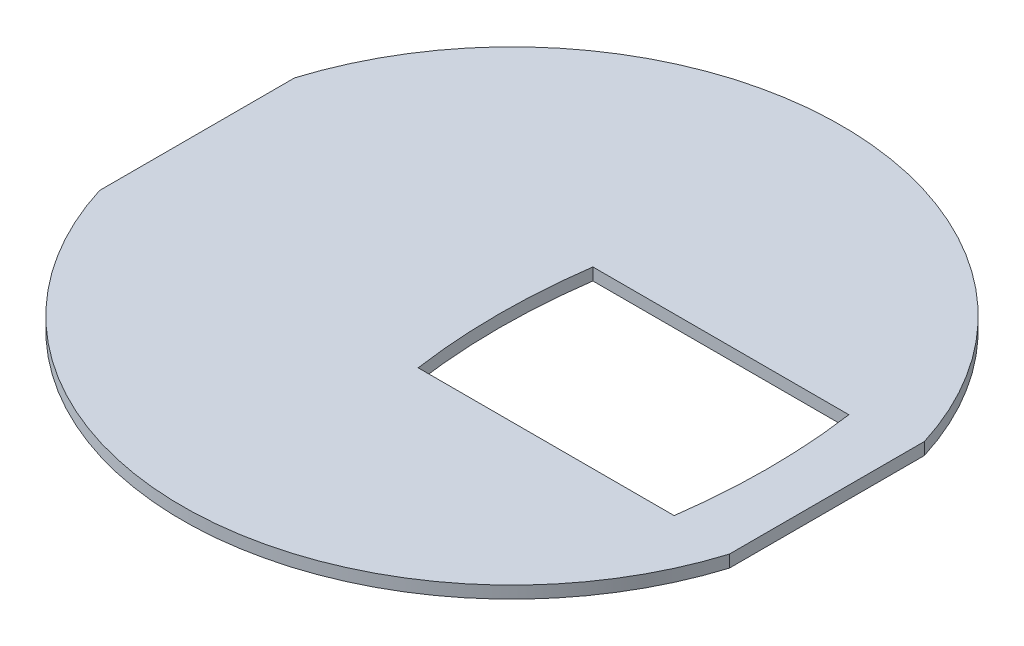
ISO-10303-21;
HEADER;
FILE_DESCRIPTION(('STEP AP214'),'2;1');
FILE_NAME('part.step','',(''),(''),'','','');
FILE_SCHEMA(('AUTOMOTIVE_DESIGN { 1 0 10303 214 1 1 1 1 }'));
ENDSEC;
DATA;
#1=APPLICATION_CONTEXT('core data for automotive mechanical design processes');
#2=APPLICATION_PROTOCOL_DEFINITION('international standard','automotive_design',2000,#1);
#3=PRODUCT_CONTEXT('',#1,'mechanical');
#4=PRODUCT('Part','Part','',(#3));
#5=PRODUCT_RELATED_PRODUCT_CATEGORY('part','',(#4));
#6=PRODUCT_DEFINITION_FORMATION('','',#4);
#7=PRODUCT_DEFINITION_CONTEXT('part definition',#1,'design');
#8=PRODUCT_DEFINITION('design','',#6,#7);
#9=PRODUCT_DEFINITION_SHAPE('','',#8);
#10=(LENGTH_UNIT() NAMED_UNIT(*) SI_UNIT(.MILLI.,.METRE.));
#11=(NAMED_UNIT(*) PLANE_ANGLE_UNIT() SI_UNIT($,.RADIAN.));
#12=(NAMED_UNIT(*) SI_UNIT($,.STERADIAN.) SOLID_ANGLE_UNIT());
#13=UNCERTAINTY_MEASURE_WITH_UNIT(LENGTH_MEASURE(1.E-05),#10,'distance_accuracy_value','');
#14=(GEOMETRIC_REPRESENTATION_CONTEXT(3) GLOBAL_UNCERTAINTY_ASSIGNED_CONTEXT((#13)) GLOBAL_UNIT_ASSIGNED_CONTEXT((#10,
#11,#12)) REPRESENTATION_CONTEXT('',''));
#15=CARTESIAN_POINT('',(0.,0.,0.));
#16=DIRECTION('',(0.,0.,1.));
#17=DIRECTION('',(1.,0.,0.));
#18=AXIS2_PLACEMENT_3D('',#15,#16,#17);
#19=CARTESIAN_POINT('',(0.,3.,0.));
#20=DIRECTION('',(0.,-1.,0.));
#21=DIRECTION('',(0.,0.,-1.));
#22=AXIS2_PLACEMENT_3D('',#19,#20,#21);
#23=CYLINDRICAL_SURFACE('',#22,81.1310667993464);
#24=CARTESIAN_POINT('',(0.,0.,0.));
#25=DIRECTION('',(0.,1.,0.));
#26=DIRECTION('',(0.,0.,1.));
#27=AXIS2_PLACEMENT_3D('',#24,#25,#26);
#28=CIRCLE('',#27,81.1310667993464);
#29=CARTESIAN_POINT('',(77.5,0.,-24.));
#30=VERTEX_POINT('',#29);
#31=CARTESIAN_POINT('',(-77.5,0.,-24.));
#32=VERTEX_POINT('',#31);
#33=EDGE_CURVE('E123',#30,#32,#28,.T.);
#34=ORIENTED_EDGE('',*,*,#33,.T.);
#35=DIRECTION('',(0.,-1.,0.));
#36=VECTOR('',#35,1.);
#37=CARTESIAN_POINT('',(-77.5,3.,-24.));
#38=LINE('',#37,#36);
#39=CARTESIAN_POINT('',(-77.5,3.,-24.));
#40=VERTEX_POINT('',#39);
#41=EDGE_CURVE('E152',#40,#32,#38,.T.);
#42=ORIENTED_EDGE('',*,*,#41,.F.);
#43=CARTESIAN_POINT('',(0.,3.,0.));
#44=DIRECTION('',(0.,1.,0.));
#45=DIRECTION('',(0.,0.,1.));
#46=AXIS2_PLACEMENT_3D('',#43,#44,#45);
#47=CIRCLE('',#46,81.1310667993464);
#48=CARTESIAN_POINT('',(77.5,3.,-24.));
#49=VERTEX_POINT('',#48);
#50=EDGE_CURVE('E126',#49,#40,#47,.T.);
#51=ORIENTED_EDGE('',*,*,#50,.F.);
#52=DIRECTION('',(0.,-1.,0.));
#53=VECTOR('',#52,1.);
#54=CARTESIAN_POINT('',(77.5,3.,-24.));
#55=LINE('',#54,#53);
#56=EDGE_CURVE('E136',#49,#30,#55,.T.);
#57=ORIENTED_EDGE('',*,*,#56,.T.);
#58=EDGE_LOOP('',(#34,#42,#51,#57));
#59=FACE_BOUND('',#58,.T.);
#60=ADVANCED_FACE('F33',(#59),#23,.T.);
#61=CARTESIAN_POINT('',(-77.5,3.,-24.));
#62=DIRECTION('',(1.,0.,0.));
#63=DIRECTION('',(0.,0.,-1.));
#64=AXIS2_PLACEMENT_3D('',#61,#62,#63);
#65=PLANE('',#64);
#66=DIRECTION('',(0.,0.,1.));
#67=VECTOR('',#66,1.);
#68=CARTESIAN_POINT('',(-77.5,0.,-24.));
#69=LINE('',#68,#67);
#70=CARTESIAN_POINT('',(-77.5,0.,24.));
#71=VERTEX_POINT('',#70);
#72=EDGE_CURVE('E139',#32,#71,#69,.T.);
#73=ORIENTED_EDGE('',*,*,#72,.T.);
#74=DIRECTION('',(0.,-1.,0.));
#75=VECTOR('',#74,1.);
#76=CARTESIAN_POINT('',(-77.5,3.,24.));
#77=LINE('',#76,#75);
#78=CARTESIAN_POINT('',(-77.5,3.,24.));
#79=VERTEX_POINT('',#78);
#80=EDGE_CURVE('E149',#79,#71,#77,.T.);
#81=ORIENTED_EDGE('',*,*,#80,.F.);
#82=DIRECTION('',(0.,0.,1.));
#83=VECTOR('',#82,1.);
#84=CARTESIAN_POINT('',(-77.5,3.,-24.));
#85=LINE('',#84,#83);
#86=EDGE_CURVE('E129',#40,#79,#85,.T.);
#87=ORIENTED_EDGE('',*,*,#86,.F.);
#88=ORIENTED_EDGE('',*,*,#41,.T.);
#89=EDGE_LOOP('',(#73,#81,#87,#88));
#90=FACE_BOUND('',#89,.T.);
#91=ADVANCED_FACE('F176',(#90),#65,.F.);
#92=CARTESIAN_POINT('',(0.,3.,0.));
#93=DIRECTION('',(0.,-1.,0.));
#94=DIRECTION('',(0.,0.,-1.));
#95=AXIS2_PLACEMENT_3D('',#92,#93,#94);
#96=CYLINDRICAL_SURFACE('',#95,81.1310667993464);
#97=CARTESIAN_POINT('',(0.,0.,0.));
#98=DIRECTION('',(0.,1.,0.));
#99=DIRECTION('',(0.,0.,1.));
#100=AXIS2_PLACEMENT_3D('',#97,#98,#99);
#101=CIRCLE('',#100,81.1310667993464);
#102=CARTESIAN_POINT('',(77.5,0.,24.));
#103=VERTEX_POINT('',#102);
#104=EDGE_CURVE('E141',#71,#103,#101,.T.);
#105=ORIENTED_EDGE('',*,*,#104,.T.);
#106=DIRECTION('',(0.,-1.,0.));
#107=VECTOR('',#106,1.);
#108=CARTESIAN_POINT('',(77.5,3.,24.));
#109=LINE('',#108,#107);
#110=CARTESIAN_POINT('',(77.5,3.,24.));
#111=VERTEX_POINT('',#110);
#112=EDGE_CURVE('E146',#111,#103,#109,.T.);
#113=ORIENTED_EDGE('',*,*,#112,.F.);
#114=CARTESIAN_POINT('',(0.,3.,0.));
#115=DIRECTION('',(0.,1.,0.));
#116=DIRECTION('',(0.,0.,1.));
#117=AXIS2_PLACEMENT_3D('',#114,#115,#116);
#118=CIRCLE('',#117,81.1310667993464);
#119=EDGE_CURVE('E132',#79,#111,#118,.T.);
#120=ORIENTED_EDGE('',*,*,#119,.F.);
#121=ORIENTED_EDGE('',*,*,#80,.T.);
#122=EDGE_LOOP('',(#105,#113,#120,#121));
#123=FACE_BOUND('',#122,.T.);
#124=ADVANCED_FACE('F181',(#123),#96,.T.);
#125=CARTESIAN_POINT('',(77.5,3.,-24.));
#126=DIRECTION('',(-1.,0.,0.));
#127=DIRECTION('',(0.,0.,1.));
#128=AXIS2_PLACEMENT_3D('',#125,#126,#127);
#129=PLANE('',#128);
#130=DIRECTION('',(0.,0.,-1.));
#131=VECTOR('',#130,1.);
#132=CARTESIAN_POINT('',(77.5,0.,-24.));
#133=LINE('',#132,#131);
#134=EDGE_CURVE('E130',#103,#30,#133,.T.);
#135=ORIENTED_EDGE('',*,*,#134,.T.);
#136=ORIENTED_EDGE('',*,*,#56,.F.);
#137=DIRECTION('',(0.,0.,-1.));
#138=VECTOR('',#137,1.);
#139=CARTESIAN_POINT('',(77.5,3.,-24.));
#140=LINE('',#139,#138);
#141=EDGE_CURVE('E134',#111,#49,#140,.T.);
#142=ORIENTED_EDGE('',*,*,#141,.F.);
#143=ORIENTED_EDGE('',*,*,#112,.T.);
#144=EDGE_LOOP('',(#135,#136,#142,#143));
#145=FACE_BOUND('',#144,.T.);
#146=ADVANCED_FACE('F194',(#145),#129,.F.);
#147=CARTESIAN_POINT('',(0.,3.,0.));
#148=DIRECTION('',(0.,1.,0.));
#149=DIRECTION('',(0.,0.,1.));
#150=AXIS2_PLACEMENT_3D('',#147,#148,#149);
#151=PLANE('',#150);
#152=CARTESIAN_POINT('',(-89.0647362828231,3.,1.0950834408699));
#153=DIRECTION('',(0.,1.,0.));
#154=DIRECTION('',(0.,0.,-1.));
#155=AXIS2_PLACEMENT_3D('',#152,#153,#154);
#156=CIRCLE('',#155,153.08206715511);
#157=CARTESIAN_POINT('',(62.5,3.,22.5950834408699));
#158=VERTEX_POINT('',#157);
#159=CARTESIAN_POINT('',(62.5,3.,-20.4049165591301));
#160=VERTEX_POINT('',#159);
#161=EDGE_CURVE('E47',#158,#160,#156,.T.);
#162=ORIENTED_EDGE('',*,*,#161,.F.);
#163=DIRECTION('',(1.,0.,0.));
#164=VECTOR('',#163,1.);
#165=CARTESIAN_POINT('',(62.5,3.,22.5950834408699));
#166=LINE('',#165,#164);
#167=CARTESIAN_POINT('',(-0.499999999999973,3.,22.5950834408699));
#168=VERTEX_POINT('',#167);
#169=EDGE_CURVE('E116',#168,#158,#166,.T.);
#170=ORIENTED_EDGE('',*,*,#169,.F.);
#171=CARTESIAN_POINT('',(150.371254969287,3.,1.09508344086993));
#172=DIRECTION('',(0.,1.,0.));
#173=DIRECTION('',(0.,0.,1.));
#174=AXIS2_PLACEMENT_3D('',#171,#172,#173);
#175=CIRCLE('',#174,152.39549066822);
#176=CARTESIAN_POINT('',(-0.49999999999998,3.,-20.4049165591301));
#177=VERTEX_POINT('',#176);
#178=EDGE_CURVE('E100',#177,#168,#175,.T.);
#179=ORIENTED_EDGE('',*,*,#178,.F.);
#180=DIRECTION('',(-1.,0.,0.));
#181=VECTOR('',#180,1.);
#182=CARTESIAN_POINT('',(62.5,3.,-20.4049165591301));
#183=LINE('',#182,#181);
#184=EDGE_CURVE('E109',#160,#177,#183,.T.);
#185=ORIENTED_EDGE('',*,*,#184,.F.);
#186=EDGE_LOOP('',(#162,#170,#179,#185));
#187=FACE_BOUND('',#186,.T.);
#188=ORIENTED_EDGE('',*,*,#50,.T.);
#189=ORIENTED_EDGE('',*,*,#86,.T.);
#190=ORIENTED_EDGE('',*,*,#119,.T.);
#191=ORIENTED_EDGE('',*,*,#141,.T.);
#192=EDGE_LOOP('',(#188,#189,#190,#191));
#193=FACE_BOUND('',#192,.T.);
#194=ADVANCED_FACE('F113',(#187,#193),#151,.T.);
#195=CARTESIAN_POINT('',(0.,0.,0.));
#196=DIRECTION('',(0.,1.,0.));
#197=DIRECTION('',(0.,0.,1.));
#198=AXIS2_PLACEMENT_3D('',#195,#196,#197);
#199=PLANE('',#198);
#200=DIRECTION('',(1.,0.,0.));
#201=VECTOR('',#200,1.);
#202=CARTESIAN_POINT('',(0.,0.,22.5950834408699));
#203=LINE('',#202,#201);
#204=CARTESIAN_POINT('',(-0.499999999999973,0.,22.5950834408699));
#205=VERTEX_POINT('',#204);
#206=CARTESIAN_POINT('',(62.5,0.,22.5950834408699));
#207=VERTEX_POINT('',#206);
#208=EDGE_CURVE('E40',#205,#207,#203,.T.);
#209=ORIENTED_EDGE('',*,*,#208,.T.);
#210=CARTESIAN_POINT('',(-89.0647362828231,0.,1.0950834408699));
#211=DIRECTION('',(0.,1.,0.));
#212=DIRECTION('',(0.,0.,1.));
#213=AXIS2_PLACEMENT_3D('',#210,#211,#212);
#214=CIRCLE('',#213,153.08206715511);
#215=CARTESIAN_POINT('',(62.5,0.,-20.4049165591301));
#216=VERTEX_POINT('',#215);
#217=EDGE_CURVE('E11',#207,#216,#214,.T.);
#218=ORIENTED_EDGE('',*,*,#217,.T.);
#219=DIRECTION('',(-1.,0.,0.));
#220=VECTOR('',#219,1.);
#221=CARTESIAN_POINT('',(0.,0.,-20.4049165591301));
#222=LINE('',#221,#220);
#223=CARTESIAN_POINT('',(-0.49999999999998,0.,-20.4049165591301));
#224=VERTEX_POINT('',#223);
#225=EDGE_CURVE('E155',#216,#224,#222,.T.);
#226=ORIENTED_EDGE('',*,*,#225,.T.);
#227=CARTESIAN_POINT('',(150.371254969287,0.,1.09508344086993));
#228=DIRECTION('',(0.,1.,0.));
#229=DIRECTION('',(0.,0.,1.));
#230=AXIS2_PLACEMENT_3D('',#227,#228,#229);
#231=CIRCLE('',#230,152.39549066822);
#232=EDGE_CURVE('E103',#224,#205,#231,.T.);
#233=ORIENTED_EDGE('',*,*,#232,.T.);
#234=EDGE_LOOP('',(#209,#218,#226,#233));
#235=FACE_BOUND('',#234,.T.);
#236=ORIENTED_EDGE('',*,*,#33,.F.);
#237=ORIENTED_EDGE('',*,*,#134,.F.);
#238=ORIENTED_EDGE('',*,*,#104,.F.);
#239=ORIENTED_EDGE('',*,*,#72,.F.);
#240=EDGE_LOOP('',(#236,#237,#238,#239));
#241=FACE_BOUND('',#240,.T.);
#242=ADVANCED_FACE('F159',(#235,#241),#199,.F.);
#243=CARTESIAN_POINT('',(-89.0647362828231,-2.5,1.0950834408699));
#244=DIRECTION('',(0.,1.,0.));
#245=DIRECTION('',(0.,0.,1.));
#246=AXIS2_PLACEMENT_3D('',#243,#244,#245);
#247=CYLINDRICAL_SURFACE('',#246,153.08206715511);
#248=DIRECTION('',(0.,1.,0.));
#249=VECTOR('',#248,1.);
#250=CARTESIAN_POINT('',(62.5,-2.5,22.5950834408699));
#251=LINE('',#250,#249);
#252=EDGE_CURVE('E121',#207,#158,#251,.T.);
#253=ORIENTED_EDGE('',*,*,#252,.T.);
#254=ORIENTED_EDGE('',*,*,#161,.T.);
#255=DIRECTION('',(0.,1.,0.));
#256=VECTOR('',#255,1.);
#257=CARTESIAN_POINT('',(62.5,-2.5,-20.4049165591301));
#258=LINE('',#257,#256);
#259=EDGE_CURVE('E106',#216,#160,#258,.T.);
#260=ORIENTED_EDGE('',*,*,#259,.F.);
#261=ORIENTED_EDGE('',*,*,#217,.F.);
#262=EDGE_LOOP('',(#253,#254,#260,#261));
#263=FACE_BOUND('',#262,.T.);
#264=ADVANCED_FACE('F164',(#263),#247,.F.);
#265=CARTESIAN_POINT('',(62.5,-2.5,22.5950834408699));
#266=DIRECTION('',(0.,0.,1.));
#267=DIRECTION('',(1.,0.,0.));
#268=AXIS2_PLACEMENT_3D('',#265,#266,#267);
#269=PLANE('',#268);
#270=DIRECTION('',(0.,1.,0.));
#271=VECTOR('',#270,1.);
#272=CARTESIAN_POINT('',(-0.499999999999973,-2.5,22.5950834408699));
#273=LINE('',#272,#271);
#274=EDGE_CURVE('E105',#205,#168,#273,.T.);
#275=ORIENTED_EDGE('',*,*,#274,.T.);
#276=ORIENTED_EDGE('',*,*,#169,.T.);
#277=ORIENTED_EDGE('',*,*,#252,.F.);
#278=ORIENTED_EDGE('',*,*,#208,.F.);
#279=EDGE_LOOP('',(#275,#276,#277,#278));
#280=FACE_BOUND('',#279,.T.);
#281=ADVANCED_FACE('F163',(#280),#269,.F.);
#282=CARTESIAN_POINT('',(150.371254969287,-2.5,1.09508344086993));
#283=DIRECTION('',(0.,1.,0.));
#284=DIRECTION('',(0.,0.,1.));
#285=AXIS2_PLACEMENT_3D('',#282,#283,#284);
#286=CYLINDRICAL_SURFACE('',#285,152.39549066822);
#287=DIRECTION('',(0.,1.,0.));
#288=VECTOR('',#287,1.);
#289=CARTESIAN_POINT('',(-0.49999999999998,-2.5,-20.4049165591301));
#290=LINE('',#289,#288);
#291=EDGE_CURVE('E55',#224,#177,#290,.T.);
#292=ORIENTED_EDGE('',*,*,#291,.T.);
#293=ORIENTED_EDGE('',*,*,#178,.T.);
#294=ORIENTED_EDGE('',*,*,#274,.F.);
#295=ORIENTED_EDGE('',*,*,#232,.F.);
#296=EDGE_LOOP('',(#292,#293,#294,#295));
#297=FACE_BOUND('',#296,.T.);
#298=ADVANCED_FACE('F97',(#297),#286,.F.);
#299=CARTESIAN_POINT('',(62.5,-2.5,-20.4049165591301));
#300=DIRECTION('',(0.,0.,-1.));
#301=DIRECTION('',(-1.,0.,0.));
#302=AXIS2_PLACEMENT_3D('',#299,#300,#301);
#303=PLANE('',#302);
#304=ORIENTED_EDGE('',*,*,#259,.T.);
#305=ORIENTED_EDGE('',*,*,#184,.T.);
#306=ORIENTED_EDGE('',*,*,#291,.F.);
#307=ORIENTED_EDGE('',*,*,#225,.F.);
#308=EDGE_LOOP('',(#304,#305,#306,#307));
#309=FACE_BOUND('',#308,.T.);
#310=ADVANCED_FACE('F110',(#309),#303,.F.);
#311=CLOSED_SHELL('',(#60,#91,#124,#146,#194,#242,#264,#281,#298,#310));
#312=MANIFOLD_SOLID_BREP('B2',#311);
#313=ADVANCED_BREP_SHAPE_REPRESENTATION('',(#18,#312),#14);
#314=SHAPE_DEFINITION_REPRESENTATION(#9,#313);
ENDSEC;
END-ISO-10303-21;
